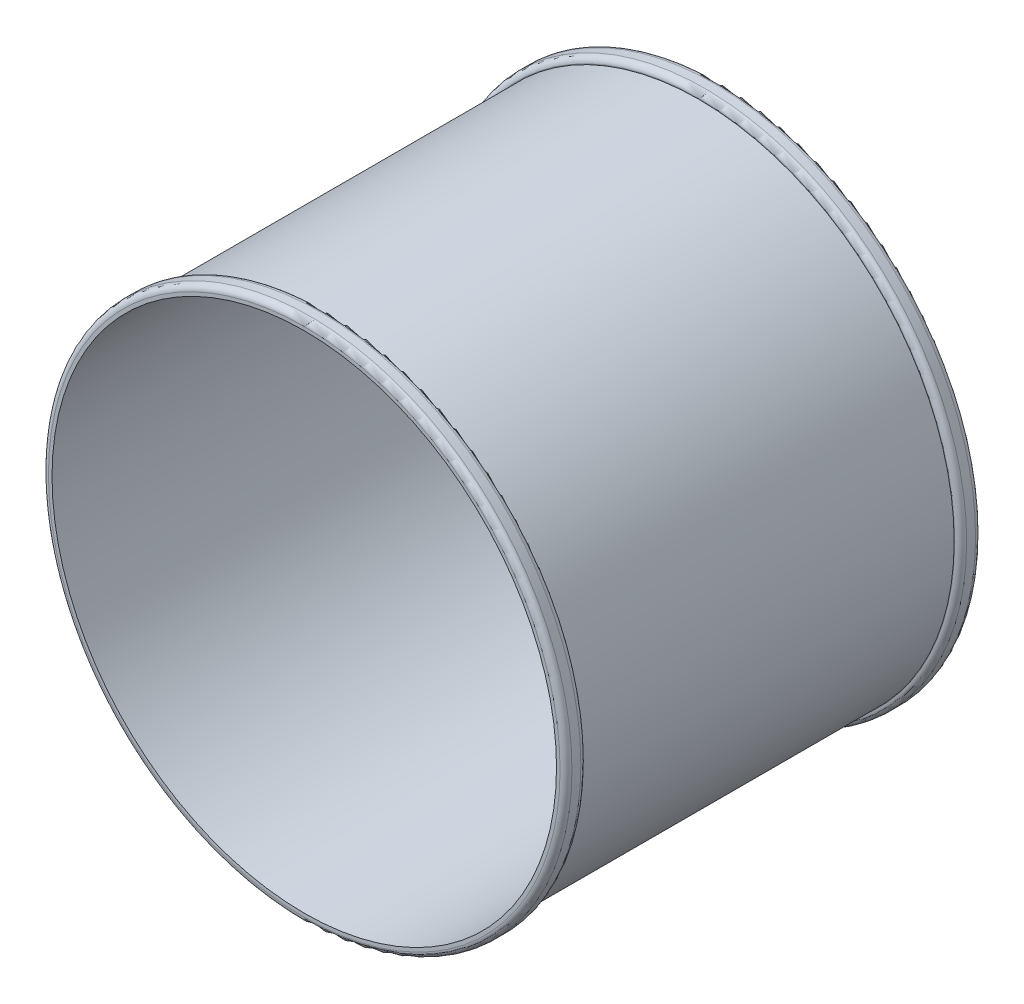
ISO-10303-21;
HEADER;
FILE_DESCRIPTION(('STEP AP214'),'2;1');
FILE_NAME('part.step','',(''),(''),'','','');
FILE_SCHEMA(('AUTOMOTIVE_DESIGN { 1 0 10303 214 1 1 1 1 }'));
ENDSEC;
DATA;
#1=APPLICATION_CONTEXT('core data for automotive mechanical design processes');
#2=APPLICATION_PROTOCOL_DEFINITION('international standard','automotive_design',2000,#1);
#3=PRODUCT_CONTEXT('',#1,'mechanical');
#4=PRODUCT('Part','Part','',(#3));
#5=PRODUCT_RELATED_PRODUCT_CATEGORY('part','',(#4));
#6=PRODUCT_DEFINITION_FORMATION('','',#4);
#7=PRODUCT_DEFINITION_CONTEXT('part definition',#1,'design');
#8=PRODUCT_DEFINITION('design','',#6,#7);
#9=PRODUCT_DEFINITION_SHAPE('','',#8);
#10=(LENGTH_UNIT() NAMED_UNIT(*) SI_UNIT(.MILLI.,.METRE.));
#11=(NAMED_UNIT(*) PLANE_ANGLE_UNIT() SI_UNIT($,.RADIAN.));
#12=(NAMED_UNIT(*) SI_UNIT($,.STERADIAN.) SOLID_ANGLE_UNIT());
#13=UNCERTAINTY_MEASURE_WITH_UNIT(LENGTH_MEASURE(1.E-05),#10,'distance_accuracy_value','');
#14=(GEOMETRIC_REPRESENTATION_CONTEXT(3) GLOBAL_UNCERTAINTY_ASSIGNED_CONTEXT((#13)) GLOBAL_UNIT_ASSIGNED_CONTEXT((#10,
#11,#12)) REPRESENTATION_CONTEXT('',''));
#15=CARTESIAN_POINT('',(0.,0.,0.));
#16=DIRECTION('',(0.,0.,1.));
#17=DIRECTION('',(1.,0.,0.));
#18=AXIS2_PLACEMENT_3D('',#15,#16,#17);
#19=CARTESIAN_POINT('',(0.,0.,35.));
#20=DIRECTION('',(0.,0.,-1.));
#21=DIRECTION('',(-1.,0.,0.));
#22=AXIS2_PLACEMENT_3D('',#19,#20,#21);
#23=CYLINDRICAL_SURFACE('',#22,43.);
#24=CARTESIAN_POINT('',(0.,0.,-31.5));
#25=DIRECTION('',(0.,0.,1.));
#26=DIRECTION('',(1.,0.,0.));
#27=AXIS2_PLACEMENT_3D('',#24,#25,#26);
#28=CIRCLE('',#27,43.);
#29=CARTESIAN_POINT('',(43.,0.,-31.5));
#30=VERTEX_POINT('',#29);
#31=EDGE_CURVE('E88',#30,#30,#28,.T.);
#32=ORIENTED_EDGE('',*,*,#31,.T.);
#33=EDGE_LOOP('',(#32));
#34=FACE_BOUND('',#33,.T.);
#35=CARTESIAN_POINT('',(0.,0.,31.5));
#36=DIRECTION('',(0.,0.,1.));
#37=DIRECTION('',(1.,0.,0.));
#38=AXIS2_PLACEMENT_3D('',#35,#36,#37);
#39=CIRCLE('',#38,43.);
#40=CARTESIAN_POINT('',(43.,0.,31.5));
#41=VERTEX_POINT('',#40);
#42=EDGE_CURVE('E83',#41,#41,#39,.T.);
#43=ORIENTED_EDGE('',*,*,#42,.F.);
#44=EDGE_LOOP('',(#43));
#45=FACE_BOUND('',#44,.T.);
#46=ADVANCED_FACE('F51',(#34,#45),#23,.T.);
#47=CARTESIAN_POINT('',(0.,0.,35.));
#48=DIRECTION('',(0.,0.,1.));
#49=DIRECTION('',(1.,0.,0.));
#50=AXIS2_PLACEMENT_3D('',#47,#48,#49);
#51=PLANE('',#50);
#52=CARTESIAN_POINT('',(0.,0.,35.));
#53=DIRECTION('',(0.,0.,1.));
#54=DIRECTION('',(1.,0.,0.));
#55=AXIS2_PLACEMENT_3D('',#52,#53,#54);
#56=CIRCLE('',#55,43.1);
#57=CARTESIAN_POINT('',(43.1,0.,35.));
#58=VERTEX_POINT('',#57);
#59=EDGE_CURVE('E80',#58,#58,#56,.T.);
#60=ORIENTED_EDGE('',*,*,#59,.T.);
#61=EDGE_LOOP('',(#60));
#62=FACE_BOUND('',#61,.T.);
#63=CARTESIAN_POINT('',(0.,0.,35.));
#64=DIRECTION('',(0.,0.,1.));
#65=DIRECTION('',(1.,0.,0.));
#66=AXIS2_PLACEMENT_3D('',#63,#64,#65);
#67=CIRCLE('',#66,42.5);
#68=CARTESIAN_POINT('',(42.5,0.,35.));
#69=VERTEX_POINT('',#68);
#70=EDGE_CURVE('E87',#69,#69,#67,.T.);
#71=ORIENTED_EDGE('',*,*,#70,.F.);
#72=EDGE_LOOP('',(#71));
#73=FACE_BOUND('',#72,.T.);
#74=ADVANCED_FACE('F114',(#62,#73),#51,.T.);
#75=CARTESIAN_POINT('',(0.,0.,-35.));
#76=DIRECTION('',(0.,0.,1.));
#77=DIRECTION('',(1.,0.,0.));
#78=AXIS2_PLACEMENT_3D('',#75,#76,#77);
#79=PLANE('',#78);
#80=CARTESIAN_POINT('',(0.,0.,-35.));
#81=DIRECTION('',(0.,0.,1.));
#82=DIRECTION('',(1.,0.,0.));
#83=AXIS2_PLACEMENT_3D('',#80,#81,#82);
#84=CIRCLE('',#83,43.1);
#85=CARTESIAN_POINT('',(43.1,0.,-35.));
#86=VERTEX_POINT('',#85);
#87=EDGE_CURVE('E58',#86,#86,#84,.F.);
#88=ORIENTED_EDGE('',*,*,#87,.T.);
#89=EDGE_LOOP('',(#88));
#90=FACE_BOUND('',#89,.T.);
#91=CARTESIAN_POINT('',(0.,0.,-35.));
#92=DIRECTION('',(0.,0.,1.));
#93=DIRECTION('',(1.,0.,0.));
#94=AXIS2_PLACEMENT_3D('',#91,#92,#93);
#95=CIRCLE('',#94,42.5);
#96=CARTESIAN_POINT('',(42.5,0.,-35.));
#97=VERTEX_POINT('',#96);
#98=EDGE_CURVE('E84',#97,#97,#95,.T.);
#99=ORIENTED_EDGE('',*,*,#98,.T.);
#100=EDGE_LOOP('',(#99));
#101=FACE_BOUND('',#100,.T.);
#102=ADVANCED_FACE('F119',(#90,#101),#79,.F.);
#103=CARTESIAN_POINT('',(0.,0.,35.));
#104=DIRECTION('',(0.,0.,-1.));
#105=DIRECTION('',(-1.,0.,0.));
#106=AXIS2_PLACEMENT_3D('',#103,#104,#105);
#107=CYLINDRICAL_SURFACE('',#106,42.5);
#108=ORIENTED_EDGE('',*,*,#70,.T.);
#109=EDGE_LOOP('',(#108));
#110=FACE_BOUND('',#109,.T.);
#111=ORIENTED_EDGE('',*,*,#98,.F.);
#112=EDGE_LOOP('',(#111));
#113=FACE_BOUND('',#112,.T.);
#114=ADVANCED_FACE('F160',(#110,#113),#107,.F.);
#115=CARTESIAN_POINT('',(0.,0.,31.5));
#116=DIRECTION('',(0.,0.,1.));
#117=DIRECTION('',(1.,0.,0.));
#118=AXIS2_PLACEMENT_3D('',#115,#116,#117);
#119=PLANE('',#118);
#120=CARTESIAN_POINT('',(0.,0.,31.5));
#121=DIRECTION('',(0.,0.,1.));
#122=DIRECTION('',(1.,0.,0.));
#123=AXIS2_PLACEMENT_3D('',#120,#121,#122);
#124=CIRCLE('',#123,43.1);
#125=CARTESIAN_POINT('',(43.1,0.,31.5));
#126=VERTEX_POINT('',#125);
#127=EDGE_CURVE('E71',#126,#126,#124,.F.);
#128=ORIENTED_EDGE('',*,*,#127,.T.);
#129=EDGE_LOOP('',(#128));
#130=FACE_BOUND('',#129,.T.);
#131=ORIENTED_EDGE('',*,*,#42,.T.);
#132=EDGE_LOOP('',(#131));
#133=FACE_BOUND('',#132,.T.);
#134=ADVANCED_FACE('F165',(#130,#133),#119,.F.);
#135=CARTESIAN_POINT('',(0.,0.,31.5));
#136=DIRECTION('',(0.,0.,1.));
#137=DIRECTION('',(1.,0.,0.));
#138=AXIS2_PLACEMENT_3D('',#135,#136,#137);
#139=CYLINDRICAL_SURFACE('',#138,44.1);
#140=CARTESIAN_POINT('',(0.,0.,34.));
#141=DIRECTION('',(0.,0.,1.));
#142=DIRECTION('',(1.,0.,0.));
#143=AXIS2_PLACEMENT_3D('',#140,#141,#142);
#144=CIRCLE('',#143,44.1);
#145=CARTESIAN_POINT('',(44.1,0.,34.));
#146=VERTEX_POINT('',#145);
#147=EDGE_CURVE('E74',#146,#146,#144,.F.);
#148=ORIENTED_EDGE('',*,*,#147,.T.);
#149=EDGE_LOOP('',(#148));
#150=FACE_BOUND('',#149,.T.);
#151=CARTESIAN_POINT('',(0.,0.,32.5));
#152=DIRECTION('',(0.,0.,1.));
#153=DIRECTION('',(1.,0.,0.));
#154=AXIS2_PLACEMENT_3D('',#151,#152,#153);
#155=CIRCLE('',#154,44.1);
#156=CARTESIAN_POINT('',(44.1,0.,32.5));
#157=VERTEX_POINT('',#156);
#158=EDGE_CURVE('E77',#157,#157,#155,.T.);
#159=ORIENTED_EDGE('',*,*,#158,.T.);
#160=EDGE_LOOP('',(#159));
#161=FACE_BOUND('',#160,.T.);
#162=ADVANCED_FACE('F125',(#150,#161),#139,.T.);
#163=CARTESIAN_POINT('',(0.,0.,34.));
#164=DIRECTION('',(0.,0.,1.));
#165=DIRECTION('',(1.,0.,0.));
#166=AXIS2_PLACEMENT_3D('',#163,#164,#165);
#167=TOROIDAL_SURFACE('',#166,43.1,1.);
#168=ORIENTED_EDGE('',*,*,#147,.F.);
#169=EDGE_LOOP('',(#168));
#170=FACE_BOUND('',#169,.T.);
#171=ORIENTED_EDGE('',*,*,#59,.F.);
#172=EDGE_LOOP('',(#171));
#173=FACE_BOUND('',#172,.T.);
#174=ADVANCED_FACE('F110',(#170,#173),#167,.T.);
#175=CARTESIAN_POINT('',(0.,0.,32.5));
#176=DIRECTION('',(0.,0.,1.));
#177=DIRECTION('',(1.,0.,0.));
#178=AXIS2_PLACEMENT_3D('',#175,#176,#177);
#179=TOROIDAL_SURFACE('',#178,43.1,1.);
#180=ORIENTED_EDGE('',*,*,#127,.F.);
#181=EDGE_LOOP('',(#180));
#182=FACE_BOUND('',#181,.T.);
#183=ORIENTED_EDGE('',*,*,#158,.F.);
#184=EDGE_LOOP('',(#183));
#185=FACE_BOUND('',#184,.T.);
#186=ADVANCED_FACE('F101',(#182,#185),#179,.T.);
#187=CARTESIAN_POINT('',(0.,0.,-31.5));
#188=DIRECTION('',(0.,0.,1.));
#189=DIRECTION('',(1.,0.,0.));
#190=AXIS2_PLACEMENT_3D('',#187,#188,#189);
#191=PLANE('',#190);
#192=CARTESIAN_POINT('',(0.,0.,-31.5));
#193=DIRECTION('',(0.,0.,1.));
#194=DIRECTION('',(1.,0.,0.));
#195=AXIS2_PLACEMENT_3D('',#192,#193,#194);
#196=CIRCLE('',#195,43.1);
#197=CARTESIAN_POINT('',(43.1,0.,-31.5));
#198=VERTEX_POINT('',#197);
#199=EDGE_CURVE('E11',#198,#198,#196,.T.);
#200=ORIENTED_EDGE('',*,*,#199,.T.);
#201=EDGE_LOOP('',(#200));
#202=FACE_BOUND('',#201,.T.);
#203=ORIENTED_EDGE('',*,*,#31,.F.);
#204=EDGE_LOOP('',(#203));
#205=FACE_BOUND('',#204,.T.);
#206=ADVANCED_FACE('F98',(#202,#205),#191,.T.);
#207=CARTESIAN_POINT('',(0.,0.,-31.5));
#208=DIRECTION('',(0.,0.,-1.));
#209=DIRECTION('',(-1.,0.,0.));
#210=AXIS2_PLACEMENT_3D('',#207,#208,#209);
#211=CYLINDRICAL_SURFACE('',#210,44.1);
#212=CARTESIAN_POINT('',(0.,0.,-34.));
#213=DIRECTION('',(0.,0.,1.));
#214=DIRECTION('',(1.,0.,0.));
#215=AXIS2_PLACEMENT_3D('',#212,#213,#214);
#216=CIRCLE('',#215,44.1);
#217=CARTESIAN_POINT('',(44.1,0.,-34.));
#218=VERTEX_POINT('',#217);
#219=EDGE_CURVE('E62',#218,#218,#216,.T.);
#220=ORIENTED_EDGE('',*,*,#219,.T.);
#221=EDGE_LOOP('',(#220));
#222=FACE_BOUND('',#221,.T.);
#223=CARTESIAN_POINT('',(0.,0.,-32.5));
#224=DIRECTION('',(0.,0.,1.));
#225=DIRECTION('',(1.,0.,0.));
#226=AXIS2_PLACEMENT_3D('',#223,#224,#225);
#227=CIRCLE('',#226,44.1);
#228=CARTESIAN_POINT('',(44.1,0.,-32.5));
#229=VERTEX_POINT('',#228);
#230=EDGE_CURVE('E66',#229,#229,#227,.F.);
#231=ORIENTED_EDGE('',*,*,#230,.T.);
#232=EDGE_LOOP('',(#231));
#233=FACE_BOUND('',#232,.T.);
#234=ADVANCED_FACE('F100',(#222,#233),#211,.T.);
#235=CARTESIAN_POINT('',(0.,0.,-34.));
#236=DIRECTION('',(0.,0.,1.));
#237=DIRECTION('',(1.,0.,0.));
#238=AXIS2_PLACEMENT_3D('',#235,#236,#237);
#239=TOROIDAL_SURFACE('',#238,43.1,1.);
#240=ORIENTED_EDGE('',*,*,#87,.F.);
#241=EDGE_LOOP('',(#240));
#242=FACE_BOUND('',#241,.T.);
#243=ORIENTED_EDGE('',*,*,#219,.F.);
#244=EDGE_LOOP('',(#243));
#245=FACE_BOUND('',#244,.T.);
#246=ADVANCED_FACE('F107',(#242,#245),#239,.T.);
#247=CARTESIAN_POINT('',(0.,0.,-32.5));
#248=DIRECTION('',(0.,0.,1.));
#249=DIRECTION('',(1.,0.,0.));
#250=AXIS2_PLACEMENT_3D('',#247,#248,#249);
#251=TOROIDAL_SURFACE('',#250,43.1,1.);
#252=ORIENTED_EDGE('',*,*,#230,.F.);
#253=EDGE_LOOP('',(#252));
#254=FACE_BOUND('',#253,.T.);
#255=ORIENTED_EDGE('',*,*,#199,.F.);
#256=EDGE_LOOP('',(#255));
#257=FACE_BOUND('',#256,.T.);
#258=ADVANCED_FACE('F53',(#254,#257),#251,.T.);
#259=CLOSED_SHELL('',(#46,#74,#102,#114,#134,#162,#174,#186,#206,#234,#246,#258));
#260=MANIFOLD_SOLID_BREP('B2',#259);
#261=ADVANCED_BREP_SHAPE_REPRESENTATION('',(#18,#260),#14);
#262=SHAPE_DEFINITION_REPRESENTATION(#9,#261);
ENDSEC;
END-ISO-10303-21;
